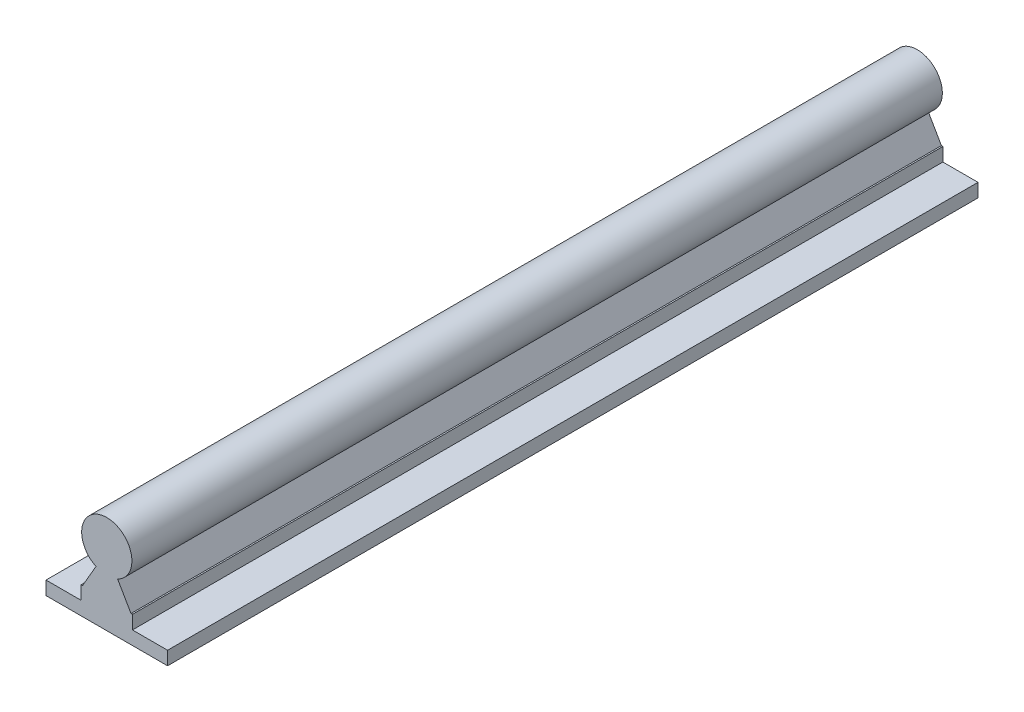
ISO-10303-21;
HEADER;
FILE_DESCRIPTION(('STEP AP214'),'2;1');
FILE_NAME('part.step','',(''),(''),'','','');
FILE_SCHEMA(('AUTOMOTIVE_DESIGN { 1 0 10303 214 1 1 1 1 }'));
ENDSEC;
DATA;
#1=APPLICATION_CONTEXT('core data for automotive mechanical design processes');
#2=APPLICATION_PROTOCOL_DEFINITION('international standard','automotive_design',2000,#1);
#3=PRODUCT_CONTEXT('',#1,'mechanical');
#4=PRODUCT('Part','Part','',(#3));
#5=PRODUCT_RELATED_PRODUCT_CATEGORY('part','',(#4));
#6=PRODUCT_DEFINITION_FORMATION('','',#4);
#7=PRODUCT_DEFINITION_CONTEXT('part definition',#1,'design');
#8=PRODUCT_DEFINITION('design','',#6,#7);
#9=PRODUCT_DEFINITION_SHAPE('','',#8);
#10=(LENGTH_UNIT() NAMED_UNIT(*) SI_UNIT(.MILLI.,.METRE.));
#11=(NAMED_UNIT(*) PLANE_ANGLE_UNIT() SI_UNIT($,.RADIAN.));
#12=(NAMED_UNIT(*) SI_UNIT($,.STERADIAN.) SOLID_ANGLE_UNIT());
#13=UNCERTAINTY_MEASURE_WITH_UNIT(LENGTH_MEASURE(1.E-05),#10,'distance_accuracy_value','');
#14=(GEOMETRIC_REPRESENTATION_CONTEXT(3) GLOBAL_UNCERTAINTY_ASSIGNED_CONTEXT((#13)) GLOBAL_UNIT_ASSIGNED_CONTEXT((#10,
#11,#12)) REPRESENTATION_CONTEXT('',''));
#15=CARTESIAN_POINT('',(0.,0.,0.));
#16=DIRECTION('',(0.,0.,1.));
#17=DIRECTION('',(1.,0.,0.));
#18=AXIS2_PLACEMENT_3D('',#15,#16,#17);
#19=CARTESIAN_POINT('',(-22.5,5.,300.));
#20=DIRECTION('',(1.,0.,0.));
#21=DIRECTION('',(0.,0.,-1.));
#22=AXIS2_PLACEMENT_3D('',#19,#20,#21);
#23=PLANE('',#22);
#24=DIRECTION('',(0.,-1.,0.));
#25=VECTOR('',#24,1.);
#26=CARTESIAN_POINT('',(-22.5,5.,0.));
#27=LINE('',#26,#25);
#28=CARTESIAN_POINT('',(-22.5,5.,0.));
#29=VERTEX_POINT('',#28);
#30=CARTESIAN_POINT('',(-22.5,0.,0.));
#31=VERTEX_POINT('',#30);
#32=EDGE_CURVE('E153',#29,#31,#27,.T.);
#33=ORIENTED_EDGE('',*,*,#32,.T.);
#34=DIRECTION('',(0.,0.,-1.));
#35=VECTOR('',#34,1.);
#36=CARTESIAN_POINT('',(-22.5,0.,300.));
#37=LINE('',#36,#35);
#38=CARTESIAN_POINT('',(-22.5,0.,300.));
#39=VERTEX_POINT('',#38);
#40=EDGE_CURVE('E11',#39,#31,#37,.T.);
#41=ORIENTED_EDGE('',*,*,#40,.F.);
#42=DIRECTION('',(0.,-1.,0.));
#43=VECTOR('',#42,1.);
#44=CARTESIAN_POINT('',(-22.5,5.,300.));
#45=LINE('',#44,#43);
#46=CARTESIAN_POINT('',(-22.5,5.,300.));
#47=VERTEX_POINT('',#46);
#48=EDGE_CURVE('E175',#47,#39,#45,.T.);
#49=ORIENTED_EDGE('',*,*,#48,.F.);
#50=DIRECTION('',(0.,0.,-1.));
#51=VECTOR('',#50,1.);
#52=CARTESIAN_POINT('',(-22.5,5.,300.));
#53=LINE('',#52,#51);
#54=EDGE_CURVE('E149',#47,#29,#53,.T.);
#55=ORIENTED_EDGE('',*,*,#54,.T.);
#56=EDGE_LOOP('',(#33,#41,#49,#55));
#57=FACE_BOUND('',#56,.T.);
#58=ADVANCED_FACE('F33',(#57),#23,.F.);
#59=CARTESIAN_POINT('',(-22.5,0.,300.));
#60=DIRECTION('',(0.,1.,0.));
#61=DIRECTION('',(0.,0.,1.));
#62=AXIS2_PLACEMENT_3D('',#59,#60,#61);
#63=PLANE('',#62);
#64=DIRECTION('',(1.,0.,0.));
#65=VECTOR('',#64,1.);
#66=CARTESIAN_POINT('',(-22.5,0.,0.));
#67=LINE('',#66,#65);
#68=CARTESIAN_POINT('',(22.5,0.,0.));
#69=VERTEX_POINT('',#68);
#70=EDGE_CURVE('E156',#31,#69,#67,.T.);
#71=ORIENTED_EDGE('',*,*,#70,.T.);
#72=DIRECTION('',(0.,0.,-1.));
#73=VECTOR('',#72,1.);
#74=CARTESIAN_POINT('',(22.5,0.,300.));
#75=LINE('',#74,#73);
#76=CARTESIAN_POINT('',(22.5,0.,300.));
#77=VERTEX_POINT('',#76);
#78=EDGE_CURVE('E41',#77,#69,#75,.T.);
#79=ORIENTED_EDGE('',*,*,#78,.F.);
#80=DIRECTION('',(1.,0.,0.));
#81=VECTOR('',#80,1.);
#82=CARTESIAN_POINT('',(-22.5,0.,300.));
#83=LINE('',#82,#81);
#84=EDGE_CURVE('E104',#39,#77,#83,.T.);
#85=ORIENTED_EDGE('',*,*,#84,.F.);
#86=ORIENTED_EDGE('',*,*,#40,.T.);
#87=EDGE_LOOP('',(#71,#79,#85,#86));
#88=FACE_BOUND('',#87,.T.);
#89=ADVANCED_FACE('F253',(#88),#63,.F.);
#90=CARTESIAN_POINT('',(22.5,0.,300.));
#91=DIRECTION('',(-1.,0.,0.));
#92=DIRECTION('',(0.,0.,1.));
#93=AXIS2_PLACEMENT_3D('',#90,#91,#92);
#94=PLANE('',#93);
#95=DIRECTION('',(0.,1.,0.));
#96=VECTOR('',#95,1.);
#97=CARTESIAN_POINT('',(22.5,0.,0.));
#98=LINE('',#97,#96);
#99=CARTESIAN_POINT('',(22.5,5.,0.));
#100=VERTEX_POINT('',#99);
#101=EDGE_CURVE('E158',#69,#100,#98,.T.);
#102=ORIENTED_EDGE('',*,*,#101,.T.);
#103=DIRECTION('',(0.,0.,-1.));
#104=VECTOR('',#103,1.);
#105=CARTESIAN_POINT('',(22.5,5.,300.));
#106=LINE('',#105,#104);
#107=CARTESIAN_POINT('',(22.5,5.,300.));
#108=VERTEX_POINT('',#107);
#109=EDGE_CURVE('E194',#108,#100,#106,.T.);
#110=ORIENTED_EDGE('',*,*,#109,.F.);
#111=DIRECTION('',(0.,1.,0.));
#112=VECTOR('',#111,1.);
#113=CARTESIAN_POINT('',(22.5,0.,300.));
#114=LINE('',#113,#112);
#115=EDGE_CURVE('E202',#77,#108,#114,.T.);
#116=ORIENTED_EDGE('',*,*,#115,.F.);
#117=ORIENTED_EDGE('',*,*,#78,.T.);
#118=EDGE_LOOP('',(#102,#110,#116,#117));
#119=FACE_BOUND('',#118,.T.);
#120=ADVANCED_FACE('F200',(#119),#94,.F.);
#121=CARTESIAN_POINT('',(22.5,5.,300.));
#122=DIRECTION('',(0.,-1.,0.));
#123=DIRECTION('',(1.,0.,0.));
#124=AXIS2_PLACEMENT_3D('',#121,#122,#123);
#125=PLANE('',#124);
#126=DIRECTION('',(-1.,0.,0.));
#127=VECTOR('',#126,1.);
#128=CARTESIAN_POINT('',(22.5,5.,0.));
#129=LINE('',#128,#127);
#130=CARTESIAN_POINT('',(9.5,4.99999999999999,0.));
#131=VERTEX_POINT('',#130);
#132=EDGE_CURVE('E160',#100,#131,#129,.T.);
#133=ORIENTED_EDGE('',*,*,#132,.T.);
#134=DIRECTION('',(0.,0.,-1.));
#135=VECTOR('',#134,1.);
#136=CARTESIAN_POINT('',(9.5,4.99999999999999,300.));
#137=LINE('',#136,#135);
#138=CARTESIAN_POINT('',(9.5,4.99999999999999,300.));
#139=VERTEX_POINT('',#138);
#140=EDGE_CURVE('E191',#139,#131,#137,.T.);
#141=ORIENTED_EDGE('',*,*,#140,.F.);
#142=DIRECTION('',(-1.,0.,0.));
#143=VECTOR('',#142,1.);
#144=CARTESIAN_POINT('',(22.5,5.,300.));
#145=LINE('',#144,#143);
#146=EDGE_CURVE('E220',#108,#139,#145,.T.);
#147=ORIENTED_EDGE('',*,*,#146,.F.);
#148=ORIENTED_EDGE('',*,*,#109,.T.);
#149=EDGE_LOOP('',(#133,#141,#147,#148));
#150=FACE_BOUND('',#149,.T.);
#151=ADVANCED_FACE('F211',(#150),#125,.F.);
#152=CARTESIAN_POINT('',(9.5,4.99999999999999,300.));
#153=DIRECTION('',(-1.,0.,0.));
#154=DIRECTION('',(0.,-1.,0.));
#155=AXIS2_PLACEMENT_3D('',#152,#153,#154);
#156=PLANE('',#155);
#157=DIRECTION('',(0.,1.,0.));
#158=VECTOR('',#157,1.);
#159=CARTESIAN_POINT('',(9.5,4.99999999999999,0.));
#160=LINE('',#159,#158);
#161=CARTESIAN_POINT('',(9.5,9.99999999999999,0.));
#162=VERTEX_POINT('',#161);
#163=EDGE_CURVE('E162',#131,#162,#160,.T.);
#164=ORIENTED_EDGE('',*,*,#163,.T.);
#165=DIRECTION('',(0.,0.,-1.));
#166=VECTOR('',#165,1.);
#167=CARTESIAN_POINT('',(9.5,9.99999999999999,300.));
#168=LINE('',#167,#166);
#169=CARTESIAN_POINT('',(9.5,9.99999999999999,300.));
#170=VERTEX_POINT('',#169);
#171=EDGE_CURVE('E188',#170,#162,#168,.T.);
#172=ORIENTED_EDGE('',*,*,#171,.F.);
#173=DIRECTION('',(0.,1.,0.));
#174=VECTOR('',#173,1.);
#175=CARTESIAN_POINT('',(9.5,4.99999999999999,300.));
#176=LINE('',#175,#174);
#177=EDGE_CURVE('E217',#139,#170,#176,.T.);
#178=ORIENTED_EDGE('',*,*,#177,.F.);
#179=ORIENTED_EDGE('',*,*,#140,.T.);
#180=EDGE_LOOP('',(#164,#172,#178,#179));
#181=FACE_BOUND('',#180,.T.);
#182=ADVANCED_FACE('F215',(#181),#156,.F.);
#183=CARTESIAN_POINT('',(9.5,9.99999999999999,300.));
#184=DIRECTION('',(0.,-1.,0.));
#185=DIRECTION('',(1.,0.,0.));
#186=AXIS2_PLACEMENT_3D('',#183,#184,#185);
#187=PLANE('',#186);
#188=DIRECTION('',(-1.,0.,0.));
#189=VECTOR('',#188,1.);
#190=CARTESIAN_POINT('',(9.5,9.99999999999999,0.));
#191=LINE('',#190,#189);
#192=CARTESIAN_POINT('',(8.967618538082,9.99999999999999,0.));
#193=VERTEX_POINT('',#192);
#194=EDGE_CURVE('E164',#162,#193,#191,.T.);
#195=ORIENTED_EDGE('',*,*,#194,.T.);
#196=DIRECTION('',(0.,0.,-1.));
#197=VECTOR('',#196,1.);
#198=CARTESIAN_POINT('',(8.967618538082,9.99999999999999,300.));
#199=LINE('',#198,#197);
#200=CARTESIAN_POINT('',(8.967618538082,9.99999999999999,300.));
#201=VERTEX_POINT('',#200);
#202=EDGE_CURVE('E185',#201,#193,#199,.T.);
#203=ORIENTED_EDGE('',*,*,#202,.F.);
#204=DIRECTION('',(-1.,0.,0.));
#205=VECTOR('',#204,1.);
#206=CARTESIAN_POINT('',(9.5,9.99999999999999,300.));
#207=LINE('',#206,#205);
#208=EDGE_CURVE('E219',#170,#201,#207,.T.);
#209=ORIENTED_EDGE('',*,*,#208,.F.);
#210=ORIENTED_EDGE('',*,*,#171,.T.);
#211=EDGE_LOOP('',(#195,#203,#209,#210));
#212=FACE_BOUND('',#211,.T.);
#213=ADVANCED_FACE('F266',(#212),#187,.F.);
#214=CARTESIAN_POINT('',(8.967618538082,9.99999999999999,300.));
#215=DIRECTION('',(-0.866025403784439,-0.5,0.));
#216=DIRECTION('',(0.5,-0.866025403784439,0.));
#217=AXIS2_PLACEMENT_3D('',#214,#215,#216);
#218=PLANE('',#217);
#219=DIRECTION('',(-0.5,0.866025403784439,0.));
#220=VECTOR('',#219,1.);
#221=CARTESIAN_POINT('',(8.967618538082,9.99999999999999,0.));
#222=LINE('',#221,#220);
#223=CARTESIAN_POINT('',(4.,18.6041677005791,0.));
#224=VERTEX_POINT('',#223);
#225=EDGE_CURVE('E166',#193,#224,#222,.T.);
#226=ORIENTED_EDGE('',*,*,#225,.T.);
#227=DIRECTION('',(0.,0.,-1.));
#228=VECTOR('',#227,1.);
#229=CARTESIAN_POINT('',(4.,18.6041677005791,300.));
#230=LINE('',#229,#228);
#231=CARTESIAN_POINT('',(4.,18.6041677005791,300.));
#232=VERTEX_POINT('',#231);
#233=EDGE_CURVE('E182',#232,#224,#230,.T.);
#234=ORIENTED_EDGE('',*,*,#233,.F.);
#235=DIRECTION('',(-0.5,0.866025403784439,0.));
#236=VECTOR('',#235,1.);
#237=CARTESIAN_POINT('',(8.967618538082,9.99999999999999,300.));
#238=LINE('',#237,#236);
#239=EDGE_CURVE('E222',#201,#232,#238,.T.);
#240=ORIENTED_EDGE('',*,*,#239,.F.);
#241=ORIENTED_EDGE('',*,*,#202,.T.);
#242=EDGE_LOOP('',(#226,#234,#240,#241));
#243=FACE_BOUND('',#242,.T.);
#244=ADVANCED_FACE('F269',(#243),#218,.F.);
#245=CARTESIAN_POINT('',(0.,27.,300.));
#246=DIRECTION('',(0.,0.,-1.));
#247=DIRECTION('',(-1.,0.,0.));
#248=AXIS2_PLACEMENT_3D('',#245,#246,#247);
#249=CYLINDRICAL_SURFACE('',#248,9.3);
#250=CARTESIAN_POINT('',(0.,27.,0.));
#251=DIRECTION('',(0.,0.,1.));
#252=DIRECTION('',(1.,0.,0.));
#253=AXIS2_PLACEMENT_3D('',#250,#251,#252);
#254=CIRCLE('',#253,9.3);
#255=CARTESIAN_POINT('',(-4.00000000000001,18.6041677005791,0.));
#256=VERTEX_POINT('',#255);
#257=EDGE_CURVE('E168',#224,#256,#254,.T.);
#258=ORIENTED_EDGE('',*,*,#257,.T.);
#259=DIRECTION('',(0.,0.,-1.));
#260=VECTOR('',#259,1.);
#261=CARTESIAN_POINT('',(-4.00000000000001,18.6041677005791,300.));
#262=LINE('',#261,#260);
#263=CARTESIAN_POINT('',(-4.00000000000001,18.6041677005791,300.));
#264=VERTEX_POINT('',#263);
#265=EDGE_CURVE('E179',#264,#256,#262,.T.);
#266=ORIENTED_EDGE('',*,*,#265,.F.);
#267=CARTESIAN_POINT('',(0.,27.,300.));
#268=DIRECTION('',(0.,0.,1.));
#269=DIRECTION('',(1.,0.,0.));
#270=AXIS2_PLACEMENT_3D('',#267,#268,#269);
#271=CIRCLE('',#270,9.3);
#272=EDGE_CURVE('E228',#232,#264,#271,.T.);
#273=ORIENTED_EDGE('',*,*,#272,.F.);
#274=ORIENTED_EDGE('',*,*,#233,.T.);
#275=EDGE_LOOP('',(#258,#266,#273,#274));
#276=FACE_BOUND('',#275,.T.);
#277=ADVANCED_FACE('F234',(#276),#249,.T.);
#278=CARTESIAN_POINT('',(-4.00000000000001,18.6041677005791,300.));
#279=DIRECTION('',(0.866025403784439,-0.5,0.));
#280=DIRECTION('',(0.5,0.866025403784439,0.));
#281=AXIS2_PLACEMENT_3D('',#278,#279,#280);
#282=PLANE('',#281);
#283=DIRECTION('',(-0.5,-0.866025403784439,0.));
#284=VECTOR('',#283,1.);
#285=CARTESIAN_POINT('',(-4.00000000000001,18.6041677005791,0.));
#286=LINE('',#285,#284);
#287=CARTESIAN_POINT('',(-8.96761853808201,10.,0.));
#288=VERTEX_POINT('',#287);
#289=EDGE_CURVE('E170',#256,#288,#286,.T.);
#290=ORIENTED_EDGE('',*,*,#289,.T.);
#291=DIRECTION('',(0.,0.,-1.));
#292=VECTOR('',#291,1.);
#293=CARTESIAN_POINT('',(-8.96761853808201,10.,300.));
#294=LINE('',#293,#292);
#295=CARTESIAN_POINT('',(-8.96761853808201,10.,300.));
#296=VERTEX_POINT('',#295);
#297=EDGE_CURVE('E144',#296,#288,#294,.T.);
#298=ORIENTED_EDGE('',*,*,#297,.F.);
#299=DIRECTION('',(-0.5,-0.866025403784439,0.));
#300=VECTOR('',#299,1.);
#301=CARTESIAN_POINT('',(-4.00000000000001,18.6041677005791,300.));
#302=LINE('',#301,#300);
#303=EDGE_CURVE('E135',#264,#296,#302,.T.);
#304=ORIENTED_EDGE('',*,*,#303,.F.);
#305=ORIENTED_EDGE('',*,*,#265,.T.);
#306=EDGE_LOOP('',(#290,#298,#304,#305));
#307=FACE_BOUND('',#306,.T.);
#308=ADVANCED_FACE('F238',(#307),#282,.F.);
#309=CARTESIAN_POINT('',(-8.96761853808201,10.,300.));
#310=DIRECTION('',(0.,-1.,0.));
#311=DIRECTION('',(0.,0.,-1.));
#312=AXIS2_PLACEMENT_3D('',#309,#310,#311);
#313=PLANE('',#312);
#314=DIRECTION('',(-1.,0.,0.));
#315=VECTOR('',#314,1.);
#316=CARTESIAN_POINT('',(-8.96761853808201,10.,0.));
#317=LINE('',#316,#315);
#318=CARTESIAN_POINT('',(-9.50000000000001,10.,0.));
#319=VERTEX_POINT('',#318);
#320=EDGE_CURVE('E143',#288,#319,#317,.T.);
#321=ORIENTED_EDGE('',*,*,#320,.T.);
#322=DIRECTION('',(0.,0.,-1.));
#323=VECTOR('',#322,1.);
#324=CARTESIAN_POINT('',(-9.50000000000001,10.,300.));
#325=LINE('',#324,#323);
#326=CARTESIAN_POINT('',(-9.50000000000001,10.,300.));
#327=VERTEX_POINT('',#326);
#328=EDGE_CURVE('E140',#327,#319,#325,.T.);
#329=ORIENTED_EDGE('',*,*,#328,.F.);
#330=DIRECTION('',(-1.,0.,0.));
#331=VECTOR('',#330,1.);
#332=CARTESIAN_POINT('',(-8.96761853808201,10.,300.));
#333=LINE('',#332,#331);
#334=EDGE_CURVE('E129',#296,#327,#333,.T.);
#335=ORIENTED_EDGE('',*,*,#334,.F.);
#336=ORIENTED_EDGE('',*,*,#297,.T.);
#337=EDGE_LOOP('',(#321,#329,#335,#336));
#338=FACE_BOUND('',#337,.T.);
#339=ADVANCED_FACE('F141',(#338),#313,.F.);
#340=CARTESIAN_POINT('',(-9.50000000000001,10.,300.));
#341=DIRECTION('',(1.,0.,0.));
#342=DIRECTION('',(0.,1.,0.));
#343=AXIS2_PLACEMENT_3D('',#340,#341,#342);
#344=PLANE('',#343);
#345=DIRECTION('',(0.,-1.,0.));
#346=VECTOR('',#345,1.);
#347=CARTESIAN_POINT('',(-9.50000000000001,10.,0.));
#348=LINE('',#347,#346);
#349=CARTESIAN_POINT('',(-9.5,5.,0.));
#350=VERTEX_POINT('',#349);
#351=EDGE_CURVE('E90',#319,#350,#348,.T.);
#352=ORIENTED_EDGE('',*,*,#351,.T.);
#353=DIRECTION('',(0.,0.,-1.));
#354=VECTOR('',#353,1.);
#355=CARTESIAN_POINT('',(-9.5,5.,300.));
#356=LINE('',#355,#354);
#357=CARTESIAN_POINT('',(-9.5,5.,300.));
#358=VERTEX_POINT('',#357);
#359=EDGE_CURVE('E145',#358,#350,#356,.T.);
#360=ORIENTED_EDGE('',*,*,#359,.F.);
#361=DIRECTION('',(0.,-1.,0.));
#362=VECTOR('',#361,1.);
#363=CARTESIAN_POINT('',(-9.50000000000001,10.,300.));
#364=LINE('',#363,#362);
#365=EDGE_CURVE('E133',#327,#358,#364,.T.);
#366=ORIENTED_EDGE('',*,*,#365,.F.);
#367=ORIENTED_EDGE('',*,*,#328,.T.);
#368=EDGE_LOOP('',(#352,#360,#366,#367));
#369=FACE_BOUND('',#368,.T.);
#370=ADVANCED_FACE('F147',(#369),#344,.F.);
#371=CARTESIAN_POINT('',(-9.5,5.,300.));
#372=DIRECTION('',(0.,-1.,0.));
#373=DIRECTION('',(1.,0.,0.));
#374=AXIS2_PLACEMENT_3D('',#371,#372,#373);
#375=PLANE('',#374);
#376=DIRECTION('',(-1.,0.,0.));
#377=VECTOR('',#376,1.);
#378=CARTESIAN_POINT('',(-9.5,5.,0.));
#379=LINE('',#378,#377);
#380=EDGE_CURVE('E96',#350,#29,#379,.T.);
#381=ORIENTED_EDGE('',*,*,#380,.T.);
#382=ORIENTED_EDGE('',*,*,#54,.F.);
#383=DIRECTION('',(-1.,0.,0.));
#384=VECTOR('',#383,1.);
#385=CARTESIAN_POINT('',(-9.5,5.,300.));
#386=LINE('',#385,#384);
#387=EDGE_CURVE('E49',#358,#47,#386,.T.);
#388=ORIENTED_EDGE('',*,*,#387,.F.);
#389=ORIENTED_EDGE('',*,*,#359,.T.);
#390=EDGE_LOOP('',(#381,#382,#388,#389));
#391=FACE_BOUND('',#390,.T.);
#392=ADVANCED_FACE('F242',(#391),#375,.F.);
#393=CARTESIAN_POINT('',(0.,27.,300.));
#394=DIRECTION('',(0.,0.,1.));
#395=DIRECTION('',(1.,0.,0.));
#396=AXIS2_PLACEMENT_3D('',#393,#394,#395);
#397=PLANE('',#396);
#398=ORIENTED_EDGE('',*,*,#48,.T.);
#399=ORIENTED_EDGE('',*,*,#84,.T.);
#400=ORIENTED_EDGE('',*,*,#115,.T.);
#401=ORIENTED_EDGE('',*,*,#146,.T.);
#402=ORIENTED_EDGE('',*,*,#177,.T.);
#403=ORIENTED_EDGE('',*,*,#208,.T.);
#404=ORIENTED_EDGE('',*,*,#239,.T.);
#405=ORIENTED_EDGE('',*,*,#272,.T.);
#406=ORIENTED_EDGE('',*,*,#303,.T.);
#407=ORIENTED_EDGE('',*,*,#334,.T.);
#408=ORIENTED_EDGE('',*,*,#365,.T.);
#409=ORIENTED_EDGE('',*,*,#387,.T.);
#410=EDGE_LOOP('',(#398,#399,#400,#401,#402,#403,#404,#405,#406,#407,#408,#409));
#411=FACE_BOUND('',#410,.T.);
#412=ADVANCED_FACE('F131',(#411),#397,.T.);
#413=CARTESIAN_POINT('',(0.,27.,0.));
#414=DIRECTION('',(0.,0.,1.));
#415=DIRECTION('',(1.,0.,0.));
#416=AXIS2_PLACEMENT_3D('',#413,#414,#415);
#417=PLANE('',#416);
#418=ORIENTED_EDGE('',*,*,#32,.F.);
#419=ORIENTED_EDGE('',*,*,#380,.F.);
#420=ORIENTED_EDGE('',*,*,#351,.F.);
#421=ORIENTED_EDGE('',*,*,#320,.F.);
#422=ORIENTED_EDGE('',*,*,#289,.F.);
#423=ORIENTED_EDGE('',*,*,#257,.F.);
#424=ORIENTED_EDGE('',*,*,#225,.F.);
#425=ORIENTED_EDGE('',*,*,#194,.F.);
#426=ORIENTED_EDGE('',*,*,#163,.F.);
#427=ORIENTED_EDGE('',*,*,#132,.F.);
#428=ORIENTED_EDGE('',*,*,#101,.F.);
#429=ORIENTED_EDGE('',*,*,#70,.F.);
#430=EDGE_LOOP('',(#418,#419,#420,#421,#422,#423,#424,#425,#426,#427,#428,#429));
#431=FACE_BOUND('',#430,.T.);
#432=ADVANCED_FACE('F206',(#431),#417,.F.);
#433=CLOSED_SHELL('',(#58,#89,#120,#151,#182,#213,#244,#277,#308,#339,#370,#392,#412,#432));
#434=MANIFOLD_SOLID_BREP('B2',#433);
#435=ADVANCED_BREP_SHAPE_REPRESENTATION('',(#18,#434),#14);
#436=SHAPE_DEFINITION_REPRESENTATION(#9,#435);
ENDSEC;
END-ISO-10303-21;
